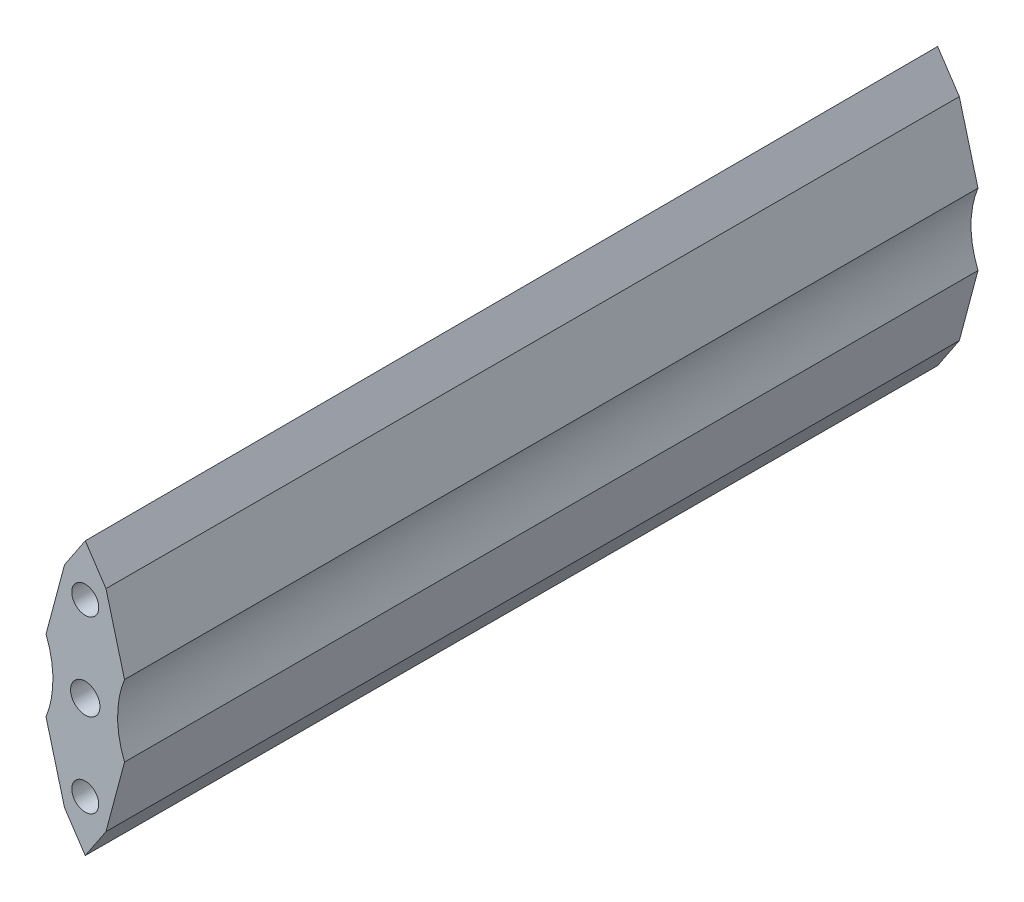
ISO-10303-21;
HEADER;
FILE_DESCRIPTION(('STEP AP214'),'2;1');
FILE_NAME('part.step','',(''),(''),'','','');
FILE_SCHEMA(('AUTOMOTIVE_DESIGN { 1 0 10303 214 1 1 1 1 }'));
ENDSEC;
DATA;
#1=APPLICATION_CONTEXT('core data for automotive mechanical design processes');
#2=APPLICATION_PROTOCOL_DEFINITION('international standard','automotive_design',2000,#1);
#3=PRODUCT_CONTEXT('',#1,'mechanical');
#4=PRODUCT('Part','Part','',(#3));
#5=PRODUCT_RELATED_PRODUCT_CATEGORY('part','',(#4));
#6=PRODUCT_DEFINITION_FORMATION('','',#4);
#7=PRODUCT_DEFINITION_CONTEXT('part definition',#1,'design');
#8=PRODUCT_DEFINITION('design','',#6,#7);
#9=PRODUCT_DEFINITION_SHAPE('','',#8);
#10=(LENGTH_UNIT() NAMED_UNIT(*) SI_UNIT(.MILLI.,.METRE.));
#11=(NAMED_UNIT(*) PLANE_ANGLE_UNIT() SI_UNIT($,.RADIAN.));
#12=(NAMED_UNIT(*) SI_UNIT($,.STERADIAN.) SOLID_ANGLE_UNIT());
#13=UNCERTAINTY_MEASURE_WITH_UNIT(LENGTH_MEASURE(1.E-05),#10,'distance_accuracy_value','');
#14=(GEOMETRIC_REPRESENTATION_CONTEXT(3) GLOBAL_UNCERTAINTY_ASSIGNED_CONTEXT((#13)) GLOBAL_UNIT_ASSIGNED_CONTEXT((#10,
#11,#12)) REPRESENTATION_CONTEXT('',''));
#15=CARTESIAN_POINT('',(0.,0.,0.));
#16=DIRECTION('',(0.,0.,1.));
#17=DIRECTION('',(1.,0.,0.));
#18=AXIS2_PLACEMENT_3D('',#15,#16,#17);
#19=CARTESIAN_POINT('',(0.,0.,709.));
#20=DIRECTION('',(0.,0.,-1.));
#21=DIRECTION('',(-1.,0.,0.));
#22=AXIS2_PLACEMENT_3D('',#19,#20,#21);
#23=CYLINDRICAL_SURFACE('',#22,3.1);
#24=CARTESIAN_POINT('',(0.,0.,540.));
#25=DIRECTION('',(0.,0.,-1.));
#26=DIRECTION('',(-1.,0.,0.));
#27=AXIS2_PLACEMENT_3D('',#24,#25,#26);
#28=CIRCLE('',#27,3.1);
#29=CARTESIAN_POINT('',(-3.1,0.,540.));
#30=VERTEX_POINT('',#29);
#31=EDGE_CURVE('E514',#30,#30,#28,.F.);
#32=ORIENTED_EDGE('',*,*,#31,.T.);
#33=EDGE_LOOP('',(#32));
#34=FACE_BOUND('',#33,.T.);
#35=CARTESIAN_POINT('',(0.,0.,360.));
#36=DIRECTION('',(0.,0.,-1.));
#37=DIRECTION('',(-1.,0.,0.));
#38=AXIS2_PLACEMENT_3D('',#35,#36,#37);
#39=CIRCLE('',#38,3.1);
#40=CARTESIAN_POINT('',(-3.1,0.,360.));
#41=VERTEX_POINT('',#40);
#42=EDGE_CURVE('E372',#41,#41,#39,.F.);
#43=ORIENTED_EDGE('',*,*,#42,.F.);
#44=EDGE_LOOP('',(#43));
#45=FACE_BOUND('',#44,.T.);
#46=ADVANCED_FACE('F273',(#34,#45),#23,.F.);
#47=CARTESIAN_POINT('',(0.,0.,360.));
#48=DIRECTION('',(0.,0.,-1.));
#49=DIRECTION('',(-1.,0.,0.));
#50=AXIS2_PLACEMENT_3D('',#47,#48,#49);
#51=PLANE('',#50);
#52=DIRECTION('',(-0.554700196225229,0.832050294337843,0.));
#53=VECTOR('',#52,1.);
#54=CARTESIAN_POINT('',(4.62557736754797,22.2503849116986,360.));
#55=LINE('',#54,#53);
#56=CARTESIAN_POINT('',(4.5843463927334,22.3122313739205,360.));
#57=VERTEX_POINT('',#56);
#58=CARTESIAN_POINT('',(0.,29.1887509630206,360.));
#59=VERTEX_POINT('',#58);
#60=EDGE_CURVE('E297',#57,#59,#55,.T.);
#61=ORIENTED_EDGE('',*,*,#60,.F.);
#62=DIRECTION('',(-0.257662650560332,0.966234939601246,0.));
#63=VECTOR('',#62,1.);
#64=CARTESIAN_POINT('',(8.56519427717944,7.38405180724785,360.));
#65=LINE('',#64,#63);
#66=CARTESIAN_POINT('',(8.52632546890441,7.5298098382792,360.));
#67=VERTEX_POINT('',#66);
#68=EDGE_CURVE('E365',#67,#57,#65,.T.);
#69=ORIENTED_EDGE('',*,*,#68,.F.);
#70=CARTESIAN_POINT('',(8.52632546890441,-7.5298098382792,360.));
#71=CARTESIAN_POINT('',(8.40357068639655,-7.22878131431198,360.));
#72=CARTESIAN_POINT('',(8.28819431094961,-6.92480692392409,360.));
#73=CARTESIAN_POINT('',(8.07242706369381,-6.31157209057555,360.));
#74=CARTESIAN_POINT('',(7.97203677984036,-6.00231144074718,360.));
#75=CARTESIAN_POINT('',(7.69345494716293,-5.06671574131331,360.));
#76=CARTESIAN_POINT('',(7.53818022552715,-4.43337091255604,360.));
#77=CARTESIAN_POINT('',(7.30762890343135,-3.24386545821019,360.));
#78=CARTESIAN_POINT('',(7.2242197770674,-2.68924771151612,360.));
#79=CARTESIAN_POINT('',(7.10437392148103,-1.57471576402119,360.));
#80=CARTESIAN_POINT('',(7.06795326393123,-1.01479981697969,360.));
#81=CARTESIAN_POINT('',(7.04239993433726,0.106300884457215,360.));
#82=CARTESIAN_POINT('',(7.05328542480139,0.667486043485986,360.));
#83=CARTESIAN_POINT('',(7.12231058573083,1.78683670556231,360.));
#84=CARTESIAN_POINT('',(7.18043741996177,2.34500298742044,360.));
#85=CARTESIAN_POINT('',(7.32030716237934,3.29670313530531,360.));
#86=CARTESIAN_POINT('',(7.39064749303244,3.69195340251773,360.));
#87=CARTESIAN_POINT('',(7.55503754445674,4.47744544549085,360.));
#88=CARTESIAN_POINT('',(7.64908323942415,4.86768805987059,360.));
#89=CARTESIAN_POINT('',(7.86038315439835,5.64117208221554,360.));
#90=CARTESIAN_POINT('',(7.97760060347785,6.02442354515719,360.));
#91=CARTESIAN_POINT('',(8.23491464382139,6.78324306617003,360.));
#92=CARTESIAN_POINT('',(8.37501529153998,7.15880974867025,360.));
#93=CARTESIAN_POINT('',(8.52632546890441,7.5298098382792,360.));
#94=B_SPLINE_CURVE_WITH_KNOTS('',3,(#70,#71,#72,#73,#74,#75,#76,#77,#78,#79,#80,#81,#82,#83,#84,
#85,#86,#87,#88,#89,#90,#91,#92,#93),.UNSPECIFIED.,.F.,.F.,(4,2,2,2,2,2,2,2,2,2,2,4),(0.,
0.975072012490937,1.9501822703299,3.90299636643886,5.58368699524673,7.2649523257944,
8.9468632107568,10.6283172461552,11.8320205944874,13.0355196594192,14.2371240219002,
15.4389416217953),.UNSPECIFIED.);
#95=CARTESIAN_POINT('',(8.52632546890441,-7.5298098382792,360.));
#96=VERTEX_POINT('',#95);
#97=EDGE_CURVE('E465',#96,#67,#94,.T.);
#98=ORIENTED_EDGE('',*,*,#97,.F.);
#99=DIRECTION('',(0.257662650560332,0.966234939601246,0.));
#100=VECTOR('',#99,1.);
#101=CARTESIAN_POINT('',(4.56519427717944,-22.3840518072479,360.));
#102=LINE('',#101,#100);
#103=CARTESIAN_POINT('',(4.5843463927334,-22.3122313739205,360.));
#104=VERTEX_POINT('',#103);
#105=EDGE_CURVE('E427',#104,#96,#102,.T.);
#106=ORIENTED_EDGE('',*,*,#105,.F.);
#107=DIRECTION('',(0.554700196225229,0.832050294337843,0.));
#108=VECTOR('',#107,1.);
#109=CARTESIAN_POINT('',(-0.374422632452027,-29.7503849116986,360.));
#110=LINE('',#109,#108);
#111=CARTESIAN_POINT('',(0.,-29.1887509630206,360.));
#112=VERTEX_POINT('',#111);
#113=EDGE_CURVE('E425',#112,#104,#110,.T.);
#114=ORIENTED_EDGE('',*,*,#113,.F.);
#115=DIRECTION('',(0.554700196225229,-0.832050294337843,0.));
#116=VECTOR('',#115,1.);
#117=CARTESIAN_POINT('',(-4.62557736754797,-22.2503849116986,360.));
#118=LINE('',#117,#116);
#119=CARTESIAN_POINT('',(-4.58434639273339,-22.3122313739205,360.));
#120=VERTEX_POINT('',#119);
#121=EDGE_CURVE('E503',#120,#112,#118,.T.);
#122=ORIENTED_EDGE('',*,*,#121,.F.);
#123=DIRECTION('',(0.257662650560333,-0.966234939601246,0.));
#124=VECTOR('',#123,1.);
#125=CARTESIAN_POINT('',(-8.56519427717944,-7.38405180724785,360.));
#126=LINE('',#125,#124);
#127=CARTESIAN_POINT('',(-8.52632546890441,-7.5298098382792,360.));
#128=VERTEX_POINT('',#127);
#129=EDGE_CURVE('E479',#128,#120,#126,.T.);
#130=ORIENTED_EDGE('',*,*,#129,.F.);
#131=CARTESIAN_POINT('',(-8.52632546890441,7.5298098382792,360.));
#132=CARTESIAN_POINT('',(-8.40357068639655,7.22878131431198,360.));
#133=CARTESIAN_POINT('',(-8.28819431094961,6.9248069239241,360.));
#134=CARTESIAN_POINT('',(-8.0724270636938,6.31157209057556,360.));
#135=CARTESIAN_POINT('',(-7.97203677984036,6.00231144074719,360.));
#136=CARTESIAN_POINT('',(-7.69345494716293,5.06671574131332,360.));
#137=CARTESIAN_POINT('',(-7.53818022552716,4.43337091255606,360.));
#138=CARTESIAN_POINT('',(-7.30762890343136,3.2438654582102,360.));
#139=CARTESIAN_POINT('',(-7.2242197770674,2.68924771151613,360.));
#140=CARTESIAN_POINT('',(-7.10437392148102,1.5747157640212,360.));
#141=CARTESIAN_POINT('',(-7.06795326393122,1.01479981697968,360.));
#142=CARTESIAN_POINT('',(-7.04239993433726,-0.106300884457227,360.));
#143=CARTESIAN_POINT('',(-7.05328542480139,-0.667486043486004,360.));
#144=CARTESIAN_POINT('',(-7.12231058573084,-1.78683670556234,360.));
#145=CARTESIAN_POINT('',(-7.18043741996177,-2.34500298742048,360.));
#146=CARTESIAN_POINT('',(-7.32030716237935,-3.29670313530534,360.));
#147=CARTESIAN_POINT('',(-7.39064749303245,-3.69195340251776,360.));
#148=CARTESIAN_POINT('',(-7.55503754445675,-4.47744544549087,360.));
#149=CARTESIAN_POINT('',(-7.64908323942416,-4.86768805987061,360.));
#150=CARTESIAN_POINT('',(-7.86038315439836,-5.64117208221556,360.));
#151=CARTESIAN_POINT('',(-7.97760060347785,-6.0244235451572,360.));
#152=CARTESIAN_POINT('',(-8.2349146438214,-6.78324306617004,360.));
#153=CARTESIAN_POINT('',(-8.37501529153999,-7.15880974867025,360.));
#154=CARTESIAN_POINT('',(-8.52632546890441,-7.5298098382792,360.));
#155=B_SPLINE_CURVE_WITH_KNOTS('',3,(#131,#132,#133,#134,#135,#136,#137,#138,#139,#140,#141,
#142,#143,#144,#145,#146,#147,#148,#149,#150,#151,#152,#153,#154),.UNSPECIFIED.,.F.,.F.,(4,2,2,
2,2,2,2,2,2,2,2,4),(0.,0.975072012490932,1.95018227032989,3.90299636643885,5.58368699524673,
7.26495232579442,8.94686321075683,10.6283172461552,11.8320205944874,13.0355196594192,
14.2371240219002,15.4389416217953),.UNSPECIFIED.);
#156=CARTESIAN_POINT('',(-8.52632546890441,7.5298098382792,360.));
#157=VERTEX_POINT('',#156);
#158=EDGE_CURVE('E472',#157,#128,#155,.T.);
#159=ORIENTED_EDGE('',*,*,#158,.F.);
#160=DIRECTION('',(-0.257662650560333,-0.966234939601246,0.));
#161=VECTOR('',#160,1.);
#162=CARTESIAN_POINT('',(-4.56519427717944,22.3840518072479,360.));
#163=LINE('',#162,#161);
#164=CARTESIAN_POINT('',(-4.58434639273339,22.3122313739205,360.));
#165=VERTEX_POINT('',#164);
#166=EDGE_CURVE('E481',#165,#157,#163,.T.);
#167=ORIENTED_EDGE('',*,*,#166,.F.);
#168=DIRECTION('',(-0.554700196225229,-0.832050294337843,0.));
#169=VECTOR('',#168,1.);
#170=CARTESIAN_POINT('',(0.374422632452034,29.7503849116986,360.));
#171=LINE('',#170,#169);
#172=EDGE_CURVE('E408',#59,#165,#171,.T.);
#173=ORIENTED_EDGE('',*,*,#172,.F.);
#174=EDGE_LOOP('',(#61,#69,#98,#106,#114,#122,#130,#159,#167,#173));
#175=FACE_BOUND('',#174,.T.);
#176=ORIENTED_EDGE('',*,*,#42,.T.);
#177=EDGE_LOOP('',(#176));
#178=FACE_BOUND('',#177,.T.);
#179=CARTESIAN_POINT('',(0.,-18.,360.));
#180=DIRECTION('',(0.,0.,-1.));
#181=DIRECTION('',(-1.,0.,0.));
#182=AXIS2_PLACEMENT_3D('',#179,#180,#181);
#183=CIRCLE('',#182,2.85);
#184=CARTESIAN_POINT('',(-2.85,-18.,360.));
#185=VERTEX_POINT('',#184);
#186=EDGE_CURVE('E509',#185,#185,#183,.F.);
#187=ORIENTED_EDGE('',*,*,#186,.T.);
#188=EDGE_LOOP('',(#187));
#189=FACE_BOUND('',#188,.T.);
#190=CARTESIAN_POINT('',(0.,18.,360.));
#191=DIRECTION('',(0.,0.,-1.));
#192=DIRECTION('',(-1.,0.,0.));
#193=AXIS2_PLACEMENT_3D('',#190,#191,#192);
#194=CIRCLE('',#193,2.85);
#195=CARTESIAN_POINT('',(-2.85,18.,360.));
#196=VERTEX_POINT('',#195);
#197=EDGE_CURVE('E507',#196,#196,#194,.F.);
#198=ORIENTED_EDGE('',*,*,#197,.T.);
#199=EDGE_LOOP('',(#198));
#200=FACE_BOUND('',#199,.T.);
#201=ADVANCED_FACE('F456',(#175,#178,#189,#200),#51,.T.);
#202=CARTESIAN_POINT('',(0.,-18.,795.));
#203=DIRECTION('',(0.,0.,-1.));
#204=DIRECTION('',(-1.,0.,0.));
#205=AXIS2_PLACEMENT_3D('',#202,#203,#204);
#206=CYLINDRICAL_SURFACE('',#205,2.85);
#207=CARTESIAN_POINT('',(0.,-18.,540.));
#208=DIRECTION('',(0.,0.,-1.));
#209=DIRECTION('',(-1.,0.,0.));
#210=AXIS2_PLACEMENT_3D('',#207,#208,#209);
#211=CIRCLE('',#210,2.85);
#212=CARTESIAN_POINT('',(-2.85,-18.,540.));
#213=VERTEX_POINT('',#212);
#214=EDGE_CURVE('E517',#213,#213,#211,.F.);
#215=ORIENTED_EDGE('',*,*,#214,.T.);
#216=EDGE_LOOP('',(#215));
#217=FACE_BOUND('',#216,.T.);
#218=ORIENTED_EDGE('',*,*,#186,.F.);
#219=EDGE_LOOP('',(#218));
#220=FACE_BOUND('',#219,.T.);
#221=ADVANCED_FACE('F461',(#217,#220),#206,.F.);
#222=CARTESIAN_POINT('',(0.,18.,795.));
#223=DIRECTION('',(0.,0.,-1.));
#224=DIRECTION('',(-1.,0.,0.));
#225=AXIS2_PLACEMENT_3D('',#222,#223,#224);
#226=CYLINDRICAL_SURFACE('',#225,2.85);
#227=CARTESIAN_POINT('',(0.,18.,540.));
#228=DIRECTION('',(0.,0.,-1.));
#229=DIRECTION('',(-1.,0.,0.));
#230=AXIS2_PLACEMENT_3D('',#227,#228,#229);
#231=CIRCLE('',#230,2.85);
#232=CARTESIAN_POINT('',(-2.85,18.,540.));
#233=VERTEX_POINT('',#232);
#234=EDGE_CURVE('E520',#233,#233,#231,.F.);
#235=ORIENTED_EDGE('',*,*,#234,.T.);
#236=EDGE_LOOP('',(#235));
#237=FACE_BOUND('',#236,.T.);
#238=ORIENTED_EDGE('',*,*,#197,.F.);
#239=EDGE_LOOP('',(#238));
#240=FACE_BOUND('',#239,.T.);
#241=ADVANCED_FACE('F531',(#237,#240),#226,.F.);
#242=CARTESIAN_POINT('',(0.,30.,0.));
#243=DIRECTION('',(-0.832049644299313,0.554699762866209,0.00124999902343864));
#244=DIRECTION('',(-0.554700196225229,-0.832050294337843,0.));
#245=AXIS2_PLACEMENT_3D('',#242,#243,#244);
#246=PLANE('',#245);
#247=DIRECTION('',(-0.554700196225229,-0.832050294337843,0.));
#248=VECTOR('',#247,1.);
#249=CARTESIAN_POINT('',(0.561633948678049,29.625577367548,540.));
#250=LINE('',#249,#248);
#251=CARTESIAN_POINT('',(0.,28.7831264445309,540.));
#252=VERTEX_POINT('',#251);
#253=CARTESIAN_POINT('',(-4.37651958910009,22.2183470608808,540.));
#254=VERTEX_POINT('',#253);
#255=EDGE_CURVE('E489',#252,#254,#250,.T.);
#256=ORIENTED_EDGE('',*,*,#255,.F.);
#257=DIRECTION('',(0.,0.00225346382548676,-0.99999746094717));
#258=VECTOR('',#257,1.);
#259=CARTESIAN_POINT('',(0.,29.098612181134,400.));
#260=LINE('',#259,#258);
#261=EDGE_CURVE('E277',#252,#59,#260,.T.);
#262=ORIENTED_EDGE('',*,*,#261,.T.);
#263=ORIENTED_EDGE('',*,*,#172,.T.);
#264=DIRECTION('',(0.00115459242688266,-0.000521579098286261,0.999999197435464));
#265=VECTOR('',#264,1.);
#266=CARTESIAN_POINT('',(-4.53816265859266,22.291368193245,400.));
#267=LINE('',#266,#265);
#268=EDGE_CURVE('E386',#165,#254,#267,.T.);
#269=ORIENTED_EDGE('',*,*,#268,.T.);
#270=EDGE_LOOP('',(#256,#262,#263,#269));
#271=FACE_BOUND('',#270,.T.);
#272=ADVANCED_FACE('F488',(#271),#246,.T.);
#273=CARTESIAN_POINT('',(-5.,22.5,0.));
#274=DIRECTION('',(-0.966234184731084,0.257662449261623,0.00124999902343865));
#275=DIRECTION('',(-0.257662650560333,-0.966234939601246,0.));
#276=AXIS2_PLACEMENT_3D('',#273,#274,#275);
#277=PLANE('',#276);
#278=DIRECTION('',(-0.257662650560333,-0.966234939601246,0.));
#279=VECTOR('',#278,1.);
#280=CARTESIAN_POINT('',(-4.34779141576916,22.3260777108718,540.));
#281=LINE('',#280,#279);
#282=CARTESIAN_POINT('',(-8.28948820335662,7.54471475741881,540.));
#283=VERTEX_POINT('',#282);
#284=EDGE_CURVE('E362',#254,#283,#281,.T.);
#285=ORIENTED_EDGE('',*,*,#284,.F.);
#286=ORIENTED_EDGE('',*,*,#268,.F.);
#287=ORIENTED_EDGE('',*,*,#166,.T.);
#288=DIRECTION('',(0.00131576144292263,8.2805034369932E-05,0.999999130957198));
#289=VECTOR('',#288,1.);
#290=CARTESIAN_POINT('',(-8.47369496544935,7.53312204253245,400.));
#291=LINE('',#290,#289);
#292=EDGE_CURVE('E389',#157,#283,#291,.T.);
#293=ORIENTED_EDGE('',*,*,#292,.T.);
#294=EDGE_LOOP('',(#285,#286,#287,#293));
#295=FACE_BOUND('',#294,.T.);
#296=ADVANCED_FACE('F524',(#295),#277,.T.);
#297=CARTESIAN_POINT('',(5.,22.5,0.));
#298=DIRECTION('',(0.832049644299313,0.554699762866209,0.00124999902343864));
#299=DIRECTION('',(-0.554700196225229,0.832050294337843,0.));
#300=AXIS2_PLACEMENT_3D('',#297,#298,#299);
#301=PLANE('',#300);
#302=DIRECTION('',(-0.554700196225229,0.832050294337843,0.));
#303=VECTOR('',#302,1.);
#304=CARTESIAN_POINT('',(4.43836605132196,22.125577367548,540.));
#305=LINE('',#304,#303);
#306=CARTESIAN_POINT('',(4.3765195891001,22.2183470608808,540.));
#307=VERTEX_POINT('',#306);
#308=EDGE_CURVE('E352',#307,#252,#305,.T.);
#309=ORIENTED_EDGE('',*,*,#308,.F.);
#310=DIRECTION('',(-0.00115459242688266,-0.000521579098286261,0.999999197435464));
#311=VECTOR('',#310,1.);
#312=CARTESIAN_POINT('',(4.53816265859267,22.291368193245,400.));
#313=LINE('',#312,#311);
#314=EDGE_CURVE('E283',#57,#307,#313,.T.);
#315=ORIENTED_EDGE('',*,*,#314,.F.);
#316=ORIENTED_EDGE('',*,*,#60,.T.);
#317=ORIENTED_EDGE('',*,*,#261,.F.);
#318=EDGE_LOOP('',(#309,#315,#316,#317));
#319=FACE_BOUND('',#318,.T.);
#320=ADVANCED_FACE('F361',(#319),#301,.T.);
#321=CARTESIAN_POINT('',(-9.,7.5,0.));
#322=CARTESIAN_POINT('',(-7.94738993089869,7.5662440850649,800.));
#323=CARTESIAN_POINT('',(-8.75325555323637,6.9078133277673,0.));
#324=CARTESIAN_POINT('',(-7.70903785971492,6.96604813310095,800.));
#325=CARTESIAN_POINT('',(-8.31825720304425,5.69906975911781,0.));
#326=CARTESIAN_POINT('',(-7.28909415940078,5.74311601064957,800.000000000001));
#327=CARTESIAN_POINT('',(-7.84760675080053,3.8304786498399,0.));
#328=CARTESIAN_POINT('',(-6.83510364276034,3.85745789019627,799.999999999999));
#329=CARTESIAN_POINT('',(-7.5633644339186,1.92460591348961,0.));
#330=CARTESIAN_POINT('',(-6.56107216414013,1.93737438025298,800.));
#331=CARTESIAN_POINT('',(-7.5,0.641535561585432,0.));
#332=CARTESIAN_POINT('',(-6.5,0.645791677394109,800.));
#333=CARTESIAN_POINT('',(-7.5,-0.641535561585428,0.));
#334=CARTESIAN_POINT('',(-6.5,-0.64579167739411,800.));
#335=CARTESIAN_POINT('',(-7.56336443391862,-1.92460591348961,0.));
#336=CARTESIAN_POINT('',(-6.56107216414012,-1.93737438025299,799.999999999999));
#337=CARTESIAN_POINT('',(-7.84760675080051,-3.83047864983989,0.));
#338=CARTESIAN_POINT('',(-6.83510364276035,-3.85745789019627,800.000000000001));
#339=CARTESIAN_POINT('',(-8.31825720304427,-5.69906975911781,0.));
#340=CARTESIAN_POINT('',(-7.28909415940077,-5.74311601064957,800.));
#341=CARTESIAN_POINT('',(-8.75325555323637,-6.90781332776729,0.));
#342=CARTESIAN_POINT('',(-7.70903785971492,-6.96604813310096,800.));
#343=CARTESIAN_POINT('',(-9.,-7.5,0.));
#344=CARTESIAN_POINT('',(-7.94738993089869,-7.5662440850649,800.));
#345=B_SPLINE_SURFACE_WITH_KNOTS('',3,1,((#321,#322),(#323,#324),(#325,#326),(#327,#328),(#329,
#330),(#331,#332),(#333,#334),(#335,#336),(#337,#338),(#339,#340),(#341,#342),(#343,#344)),
.UNSPECIFIED.,.F.,.F.,.F.,(4,1,1,1,2,1,1,1,4),(2,2),(0.,0.125,0.25,0.375,0.5,0.625,0.75,0.875,
1.),(0.,1.),.UNSPECIFIED.);
#346=CARTESIAN_POINT('',(-8.28948820335662,7.54471475741881,540.));
#347=CARTESIAN_POINT('',(-8.16788936033876,7.24327679274732,540.));
#348=CARTESIAN_POINT('',(-8.053594474769,6.93895346568857,540.));
#349=CARTESIAN_POINT('',(-7.83983458670277,6.32513062381596,540.));
#350=CARTESIAN_POINT('',(-7.74037009694775,6.01563093044728,540.));
#351=CARTESIAN_POINT('',(-7.46431216810121,5.07942633163218,540.));
#352=CARTESIAN_POINT('',(-7.31039273089407,4.44585502655955,540.));
#353=CARTESIAN_POINT('',(-7.08049748672043,3.24982862460817,540.));
#354=CARTESIAN_POINT('',(-6.99700964322208,2.68878816076938,540.));
#355=CARTESIAN_POINT('',(-6.87754812481308,1.56142239527761,540.));
#356=CARTESIAN_POINT('',(-6.84159104499509,0.995095317296534,540.));
#357=CARTESIAN_POINT('',(-6.81750431666551,-0.138755420373625,540.));
#358=CARTESIAN_POINT('',(-6.82939197833938,-0.706279438879081,540.));
#359=CARTESIAN_POINT('',(-6.90095198774333,-1.83819521531443,540.));
#360=CARTESIAN_POINT('',(-6.9606107941134,-2.40258781524159,540.));
#361=CARTESIAN_POINT('',(-7.10223869209336,-3.35599310594816,540.));
#362=CARTESIAN_POINT('',(-7.17215166545461,-3.74684201891959,540.));
#363=CARTESIAN_POINT('',(-7.33491632560443,-4.52372904182979,540.));
#364=CARTESIAN_POINT('',(-7.42776640070957,-4.9097674877766,540.));
#365=CARTESIAN_POINT('',(-7.63590938733738,-5.67503186948533,540.));
#366=CARTESIAN_POINT('',(-7.75116372749119,-6.05426830714648,540.));
#367=CARTESIAN_POINT('',(-8.00381988497512,-6.80536737665681,540.));
#368=CARTESIAN_POINT('',(-8.14122574522677,-7.17722864850875,540.));
#369=CARTESIAN_POINT('',(-8.28948820335662,-7.54471475741881,540.));
#370=B_SPLINE_CURVE_WITH_KNOTS('',3,(#346,#347,#348,#349,#350,#351,#352,#353,#354,#355,#356,
#357,#358,#359,#360,#361,#362,#363,#364,#365,#366,#367,#368,#369),.UNSPECIFIED.,.F.,.F.,(4,2,2,
2,2,2,2,2,2,2,2,4),(0.,0.974912469298578,1.9498586371031,3.90245406134596,5.60220869075516,
7.30255662310153,9.00351979512778,10.7040009773578,11.8945210233999,13.0849574409191,
14.2733622596533,15.4619842227735),.UNSPECIFIED.);
#371=CARTESIAN_POINT('',(-8.28948820335662,-7.54471475741881,540.));
#372=VERTEX_POINT('',#371);
#373=EDGE_CURVE('E363',#283,#372,#370,.T.);
#374=DIRECTION('',(0.00131576144292262,-8.28050343699494E-05,0.999999130957198));
#375=VECTOR('',#374,1.);
#376=CARTESIAN_POINT('',(-8.47369496544935,-7.53312204253245,400.));
#377=LINE('',#376,#375);
#378=EDGE_CURVE('E392',#128,#372,#377,.T.);
#379=ORIENTED_EDGE('',*,*,#373,.F.);
#380=ORIENTED_EDGE('',*,*,#292,.F.);
#381=ORIENTED_EDGE('',*,*,#158,.T.);
#382=ORIENTED_EDGE('',*,*,#378,.T.);
#383=EDGE_LOOP('',(#379,#380,#381,#382));
#384=FACE_BOUND('',#383,.T.);
#385=ADVANCED_FACE('F446',(#384),#345,.T.);
#386=CARTESIAN_POINT('',(-9.,-7.5,0.));
#387=DIRECTION('',(-0.966234184731084,-0.257662449261623,0.00124999902343865));
#388=DIRECTION('',(0.257662650560333,-0.966234939601246,0.));
#389=AXIS2_PLACEMENT_3D('',#386,#387,#388);
#390=PLANE('',#389);
#391=DIRECTION('',(0.257662650560333,-0.966234939601246,0.));
#392=VECTOR('',#391,1.);
#393=CARTESIAN_POINT('',(-8.34779141576916,-7.32607771087178,540.));
#394=LINE('',#393,#392);
#395=CARTESIAN_POINT('',(-4.37651958910009,-22.2183470608808,540.));
#396=VERTEX_POINT('',#395);
#397=EDGE_CURVE('E439',#372,#396,#394,.T.);
#398=ORIENTED_EDGE('',*,*,#397,.F.);
#399=ORIENTED_EDGE('',*,*,#378,.F.);
#400=ORIENTED_EDGE('',*,*,#129,.T.);
#401=DIRECTION('',(0.00115459242688266,0.000521579098286261,0.999999197435464));
#402=VECTOR('',#401,1.);
#403=CARTESIAN_POINT('',(-4.53816265859266,-22.291368193245,400.));
#404=LINE('',#403,#402);
#405=EDGE_CURVE('E395',#120,#396,#404,.T.);
#406=ORIENTED_EDGE('',*,*,#405,.T.);
#407=EDGE_LOOP('',(#398,#399,#400,#406));
#408=FACE_BOUND('',#407,.T.);
#409=ADVANCED_FACE('F497',(#408),#390,.T.);
#410=CARTESIAN_POINT('',(-5.,-22.5,0.));
#411=DIRECTION('',(-0.832049644299313,-0.554699762866209,0.00124999902343864));
#412=DIRECTION('',(0.554700196225229,-0.832050294337843,0.));
#413=AXIS2_PLACEMENT_3D('',#410,#411,#412);
#414=PLANE('',#413);
#415=DIRECTION('',(0.554700196225229,-0.832050294337843,0.));
#416=VECTOR('',#415,1.);
#417=CARTESIAN_POINT('',(-4.43836605132195,-22.125577367548,540.));
#418=LINE('',#417,#416);
#419=CARTESIAN_POINT('',(0.,-28.7831264445309,540.));
#420=VERTEX_POINT('',#419);
#421=EDGE_CURVE('E430',#396,#420,#418,.T.);
#422=ORIENTED_EDGE('',*,*,#421,.F.);
#423=ORIENTED_EDGE('',*,*,#405,.F.);
#424=ORIENTED_EDGE('',*,*,#121,.T.);
#425=DIRECTION('',(0.,0.00225346382548676,0.99999746094717));
#426=VECTOR('',#425,1.);
#427=CARTESIAN_POINT('',(0.,-29.098612181134,400.));
#428=LINE('',#427,#426);
#429=EDGE_CURVE('E400',#112,#420,#428,.T.);
#430=ORIENTED_EDGE('',*,*,#429,.T.);
#431=EDGE_LOOP('',(#422,#423,#424,#430));
#432=FACE_BOUND('',#431,.T.);
#433=ADVANCED_FACE('F501',(#432),#414,.T.);
#434=CARTESIAN_POINT('',(0.,-30.,0.));
#435=DIRECTION('',(0.832049644299313,-0.554699762866209,0.00124999902343864));
#436=DIRECTION('',(0.554700196225229,0.832050294337843,0.));
#437=AXIS2_PLACEMENT_3D('',#434,#435,#436);
#438=PLANE('',#437);
#439=DIRECTION('',(0.554700196225229,0.832050294337843,0.));
#440=VECTOR('',#439,1.);
#441=CARTESIAN_POINT('',(-0.561633948678042,-29.625577367548,540.));
#442=LINE('',#441,#440);
#443=CARTESIAN_POINT('',(4.3765195891001,-22.2183470608808,540.));
#444=VERTEX_POINT('',#443);
#445=EDGE_CURVE('E424',#420,#444,#442,.T.);
#446=ORIENTED_EDGE('',*,*,#445,.F.);
#447=ORIENTED_EDGE('',*,*,#429,.F.);
#448=ORIENTED_EDGE('',*,*,#113,.T.);
#449=DIRECTION('',(-0.00115459242688266,0.000521579098286261,0.999999197435464));
#450=VECTOR('',#449,1.);
#451=CARTESIAN_POINT('',(4.53816265859267,-22.291368193245,400.));
#452=LINE('',#451,#450);
#453=EDGE_CURVE('E404',#104,#444,#452,.T.);
#454=ORIENTED_EDGE('',*,*,#453,.T.);
#455=EDGE_LOOP('',(#446,#447,#448,#454));
#456=FACE_BOUND('',#455,.T.);
#457=ADVANCED_FACE('F422',(#456),#438,.T.);
#458=CARTESIAN_POINT('',(5.,-22.5,0.));
#459=DIRECTION('',(0.966234184731084,-0.257662449261622,0.00124999902343865));
#460=DIRECTION('',(0.257662650560332,0.966234939601246,0.));
#461=AXIS2_PLACEMENT_3D('',#458,#459,#460);
#462=PLANE('',#461);
#463=DIRECTION('',(0.257662650560332,0.966234939601246,0.));
#464=VECTOR('',#463,1.);
#465=CARTESIAN_POINT('',(4.34779141576916,-22.3260777108718,540.));
#466=LINE('',#465,#464);
#467=CARTESIAN_POINT('',(8.28948820335662,-7.5447147574188,540.));
#468=VERTEX_POINT('',#467);
#469=EDGE_CURVE('E428',#444,#468,#466,.T.);
#470=ORIENTED_EDGE('',*,*,#469,.F.);
#471=ORIENTED_EDGE('',*,*,#453,.F.);
#472=ORIENTED_EDGE('',*,*,#105,.T.);
#473=DIRECTION('',(-0.00131576144292263,-8.28050343699494E-05,0.999999130957198));
#474=VECTOR('',#473,1.);
#475=CARTESIAN_POINT('',(8.47369496544935,-7.53312204253245,400.));
#476=LINE('',#475,#474);
#477=EDGE_CURVE('E368',#96,#468,#476,.T.);
#478=ORIENTED_EDGE('',*,*,#477,.T.);
#479=EDGE_LOOP('',(#470,#471,#472,#478));
#480=FACE_BOUND('',#479,.T.);
#481=ADVANCED_FACE('F426',(#480),#462,.T.);
#482=CARTESIAN_POINT('',(9.,-7.5,0.));
#483=CARTESIAN_POINT('',(7.94738993089869,-7.5662440850649,800.));
#484=CARTESIAN_POINT('',(8.75325555323637,-6.90781332776729,0.));
#485=CARTESIAN_POINT('',(7.70903785971492,-6.96604813310095,800.));
#486=CARTESIAN_POINT('',(8.31825720304428,-5.69906975911781,0.));
#487=CARTESIAN_POINT('',(7.28909415940079,-5.74311601064957,800.000000000001));
#488=CARTESIAN_POINT('',(7.8476067508005,-3.83047864983989,0.));
#489=CARTESIAN_POINT('',(6.83510364276033,-3.85745789019627,799.999999999999));
#490=CARTESIAN_POINT('',(7.56336443391863,-1.92460591348961,0.));
#491=CARTESIAN_POINT('',(6.56107216414014,-1.93737438025299,800.000000000001));
#492=CARTESIAN_POINT('',(7.5,-0.64153556158543,0.));
#493=CARTESIAN_POINT('',(6.5,-0.645791677394112,800.));
#494=CARTESIAN_POINT('',(7.5,0.64153556158543,0.));
#495=CARTESIAN_POINT('',(6.5,0.645791677394106,800.));
#496=CARTESIAN_POINT('',(7.56336443391863,1.92460591348961,0.));
#497=CARTESIAN_POINT('',(6.56107216414012,1.93737438025298,800.));
#498=CARTESIAN_POINT('',(7.8476067508005,3.83047864983989,0.));
#499=CARTESIAN_POINT('',(6.83510364276035,3.85745789019627,800.));
#500=CARTESIAN_POINT('',(8.31825720304427,5.69906975911781,0.));
#501=CARTESIAN_POINT('',(7.28909415940077,5.74311601064956,800.));
#502=CARTESIAN_POINT('',(8.75325555323637,6.9078133277673,0.));
#503=CARTESIAN_POINT('',(7.70903785971492,6.96604813310095,800.));
#504=CARTESIAN_POINT('',(9.,7.5,0.));
#505=CARTESIAN_POINT('',(7.94738993089869,7.56624408506489,800.));
#506=B_SPLINE_SURFACE_WITH_KNOTS('',3,1,((#482,#483),(#484,#485),(#486,#487),(#488,#489),(#490,
#491),(#492,#493),(#494,#495),(#496,#497),(#498,#499),(#500,#501),(#502,#503),(#504,#505)),
.UNSPECIFIED.,.F.,.F.,.F.,(4,1,1,1,2,1,1,1,4),(2,2),(0.,0.125,0.25,0.375,0.5,0.625,0.75,0.875,
1.),(0.,1.),.UNSPECIFIED.);
#507=CARTESIAN_POINT('',(8.28948820335662,-7.5447147574188,540.));
#508=CARTESIAN_POINT('',(8.16788936033876,-7.24327679274731,540.));
#509=CARTESIAN_POINT('',(8.053594474769,-6.93895346568857,540.));
#510=CARTESIAN_POINT('',(7.83983458670277,-6.32513062381595,540.));
#511=CARTESIAN_POINT('',(7.74037009694776,-6.01563093044727,540.));
#512=CARTESIAN_POINT('',(7.46431216810121,-5.07942633163217,540.));
#513=CARTESIAN_POINT('',(7.31039273089406,-4.44585502655953,540.));
#514=CARTESIAN_POINT('',(7.08049748672042,-3.24982862460816,540.));
#515=CARTESIAN_POINT('',(6.99700964322208,-2.68878816076937,540.));
#516=CARTESIAN_POINT('',(6.87754812481308,-1.5614223952776,540.));
#517=CARTESIAN_POINT('',(6.84159104499509,-0.995095317296532,540.));
#518=CARTESIAN_POINT('',(6.81750431666551,0.13875542037362,540.));
#519=CARTESIAN_POINT('',(6.82939197833938,0.706279438879072,540.));
#520=CARTESIAN_POINT('',(6.90095198774333,1.83819521531441,540.));
#521=CARTESIAN_POINT('',(6.9606107941134,2.40258781524157,540.));
#522=CARTESIAN_POINT('',(7.10223869209335,3.35599310594814,540.));
#523=CARTESIAN_POINT('',(7.17215166545461,3.74684201891957,540.));
#524=CARTESIAN_POINT('',(7.33491632560443,4.52372904182977,540.));
#525=CARTESIAN_POINT('',(7.42776640070957,4.90976748777659,540.));
#526=CARTESIAN_POINT('',(7.63590938733737,5.67503186948532,540.));
#527=CARTESIAN_POINT('',(7.75116372749119,6.05426830714647,540.));
#528=CARTESIAN_POINT('',(8.00381988497511,6.8053673766568,540.));
#529=CARTESIAN_POINT('',(8.14122574522677,7.17722864850874,540.));
#530=CARTESIAN_POINT('',(8.28948820335662,7.5447147574188,540.));
#531=B_SPLINE_CURVE_WITH_KNOTS('',3,(#507,#508,#509,#510,#511,#512,#513,#514,#515,#516,#517,
#518,#519,#520,#521,#522,#523,#524,#525,#526,#527,#528,#529,#530),.UNSPECIFIED.,.F.,.F.,(4,2,2,
2,2,2,2,2,2,2,2,4),(0.,0.974912469298583,1.94985863710311,3.90245406134598,5.60220869075517,
7.30255662310152,9.00351979512776,10.7040009773577,11.8945210233999,13.0849574409191,
14.2733622596533,15.4619842227735),.UNSPECIFIED.);
#532=CARTESIAN_POINT('',(8.28948820335662,7.5447147574188,540.));
#533=VERTEX_POINT('',#532);
#534=EDGE_CURVE('E289',#468,#533,#531,.T.);
#535=DIRECTION('',(-0.00131576144292263,8.2805034369932E-05,0.999999130957198));
#536=VECTOR('',#535,1.);
#537=CARTESIAN_POINT('',(8.47369496544934,7.53312204253244,400.));
#538=LINE('',#537,#536);
#539=EDGE_CURVE('E366',#67,#533,#538,.T.);
#540=ORIENTED_EDGE('',*,*,#534,.F.);
#541=ORIENTED_EDGE('',*,*,#477,.F.);
#542=ORIENTED_EDGE('',*,*,#97,.T.);
#543=ORIENTED_EDGE('',*,*,#539,.T.);
#544=EDGE_LOOP('',(#540,#541,#542,#543));
#545=FACE_BOUND('',#544,.T.);
#546=ADVANCED_FACE('F584',(#545),#506,.T.);
#547=CARTESIAN_POINT('',(9.,7.5,0.));
#548=DIRECTION('',(0.966234184731084,0.257662449261622,0.00124999902343865));
#549=DIRECTION('',(-0.257662650560332,0.966234939601246,0.));
#550=AXIS2_PLACEMENT_3D('',#547,#548,#549);
#551=PLANE('',#550);
#552=DIRECTION('',(-0.257662650560332,0.966234939601246,0.));
#553=VECTOR('',#552,1.);
#554=CARTESIAN_POINT('',(8.34779141576916,7.32607771087177,540.));
#555=LINE('',#554,#553);
#556=EDGE_CURVE('E13',#533,#307,#555,.T.);
#557=ORIENTED_EDGE('',*,*,#556,.F.);
#558=ORIENTED_EDGE('',*,*,#539,.F.);
#559=ORIENTED_EDGE('',*,*,#68,.T.);
#560=ORIENTED_EDGE('',*,*,#314,.T.);
#561=EDGE_LOOP('',(#557,#558,#559,#560));
#562=FACE_BOUND('',#561,.T.);
#563=ADVANCED_FACE('F275',(#562),#551,.T.);
#564=CARTESIAN_POINT('',(0.,0.,540.));
#565=DIRECTION('',(0.,0.,-1.));
#566=DIRECTION('',(-1.,0.,0.));
#567=AXIS2_PLACEMENT_3D('',#564,#565,#566);
#568=PLANE('',#567);
#569=ORIENTED_EDGE('',*,*,#214,.F.);
#570=EDGE_LOOP('',(#569));
#571=FACE_BOUND('',#570,.T.);
#572=ORIENTED_EDGE('',*,*,#255,.T.);
#573=ORIENTED_EDGE('',*,*,#284,.T.);
#574=ORIENTED_EDGE('',*,*,#373,.T.);
#575=ORIENTED_EDGE('',*,*,#397,.T.);
#576=ORIENTED_EDGE('',*,*,#421,.T.);
#577=ORIENTED_EDGE('',*,*,#445,.T.);
#578=ORIENTED_EDGE('',*,*,#469,.T.);
#579=ORIENTED_EDGE('',*,*,#534,.T.);
#580=ORIENTED_EDGE('',*,*,#556,.T.);
#581=ORIENTED_EDGE('',*,*,#308,.T.);
#582=EDGE_LOOP('',(#572,#573,#574,#575,#576,#577,#578,#579,#580,#581));
#583=FACE_BOUND('',#582,.T.);
#584=ORIENTED_EDGE('',*,*,#234,.F.);
#585=EDGE_LOOP('',(#584));
#586=FACE_BOUND('',#585,.T.);
#587=ORIENTED_EDGE('',*,*,#31,.F.);
#588=EDGE_LOOP('',(#587));
#589=FACE_BOUND('',#588,.T.);
#590=ADVANCED_FACE('F350',(#571,#583,#586,#589),#568,.F.);
#591=CLOSED_SHELL('',(#46,#201,#221,#241,#272,#296,#320,#385,#409,#433,#457,#481,#546,#563,#590));
#592=MANIFOLD_SOLID_BREP('B2',#591);
#593=ADVANCED_BREP_SHAPE_REPRESENTATION('',(#18,#592),#14);
#594=SHAPE_DEFINITION_REPRESENTATION(#9,#593);
ENDSEC;
END-ISO-10303-21;
